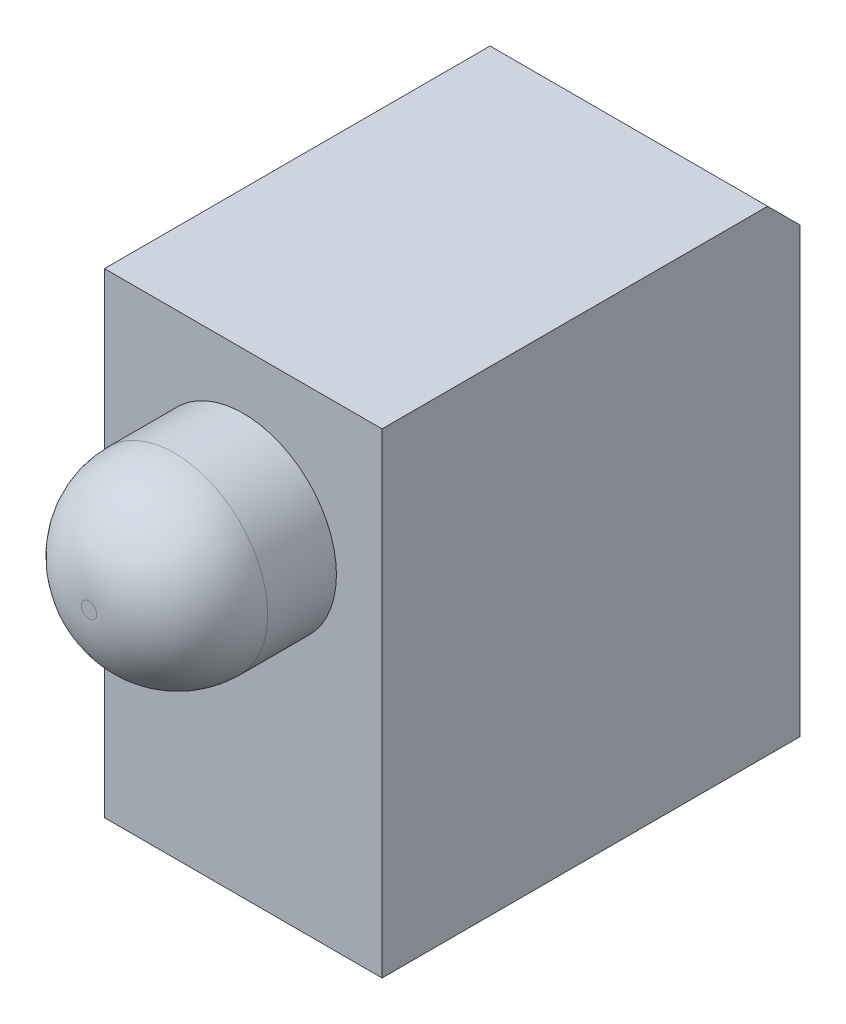
ISO-10303-21;
HEADER;
FILE_DESCRIPTION(('STEP AP214'),'2;1');
FILE_NAME('part.step','',(''),(''),'','','');
FILE_SCHEMA(('AUTOMOTIVE_DESIGN { 1 0 10303 214 1 1 1 1 }'));
ENDSEC;
DATA;
#1=APPLICATION_CONTEXT('core data for automotive mechanical design processes');
#2=APPLICATION_PROTOCOL_DEFINITION('international standard','automotive_design',2000,#1);
#3=PRODUCT_CONTEXT('',#1,'mechanical');
#4=PRODUCT('Part','Part','',(#3));
#5=PRODUCT_RELATED_PRODUCT_CATEGORY('part','',(#4));
#6=PRODUCT_DEFINITION_FORMATION('','',#4);
#7=PRODUCT_DEFINITION_CONTEXT('part definition',#1,'design');
#8=PRODUCT_DEFINITION('design','',#6,#7);
#9=PRODUCT_DEFINITION_SHAPE('','',#8);
#10=(LENGTH_UNIT() NAMED_UNIT(*) SI_UNIT(.MILLI.,.METRE.));
#11=(NAMED_UNIT(*) PLANE_ANGLE_UNIT() SI_UNIT($,.RADIAN.));
#12=(NAMED_UNIT(*) SI_UNIT($,.STERADIAN.) SOLID_ANGLE_UNIT());
#13=UNCERTAINTY_MEASURE_WITH_UNIT(LENGTH_MEASURE(1.E-05),#10,'distance_accuracy_value','');
#14=(GEOMETRIC_REPRESENTATION_CONTEXT(3) GLOBAL_UNCERTAINTY_ASSIGNED_CONTEXT((#13)) GLOBAL_UNIT_ASSIGNED_CONTEXT((#10,
#11,#12)) REPRESENTATION_CONTEXT('',''));
#15=CARTESIAN_POINT('',(0.,0.,0.));
#16=DIRECTION('',(0.,0.,1.));
#17=DIRECTION('',(1.,0.,0.));
#18=AXIS2_PLACEMENT_3D('',#15,#16,#17);
#19=CARTESIAN_POINT('',(-2.16,-3.7,3.25));
#20=DIRECTION('',(0.,0.,1.));
#21=DIRECTION('',(1.,0.,0.));
#22=AXIS2_PLACEMENT_3D('',#19,#20,#21);
#23=PLANE('',#22);
#24=DIRECTION('',(1.,0.,0.));
#25=VECTOR('',#24,1.);
#26=CARTESIAN_POINT('',(-2.16,-3.7,3.25));
#27=LINE('',#26,#25);
#28=CARTESIAN_POINT('',(-2.16,-3.7,3.25));
#29=VERTEX_POINT('',#28);
#30=CARTESIAN_POINT('',(2.16,-3.7,3.25));
#31=VERTEX_POINT('',#30);
#32=EDGE_CURVE('E91',#29,#31,#27,.T.);
#33=ORIENTED_EDGE('',*,*,#32,.T.);
#34=DIRECTION('',(0.,-1.,0.));
#35=VECTOR('',#34,1.);
#36=CARTESIAN_POINT('',(2.16,-3.7,3.25));
#37=LINE('',#36,#35);
#38=CARTESIAN_POINT('',(2.16,3.7,3.25));
#39=VERTEX_POINT('',#38);
#40=EDGE_CURVE('E80',#39,#31,#37,.T.);
#41=ORIENTED_EDGE('',*,*,#40,.F.);
#42=DIRECTION('',(1.,0.,0.));
#43=VECTOR('',#42,1.);
#44=CARTESIAN_POINT('',(-2.16,3.7,3.25));
#45=LINE('',#44,#43);
#46=CARTESIAN_POINT('',(-2.16,3.7,3.25));
#47=VERTEX_POINT('',#46);
#48=EDGE_CURVE('E85',#47,#39,#45,.T.);
#49=ORIENTED_EDGE('',*,*,#48,.F.);
#50=DIRECTION('',(0.,-1.,0.));
#51=VECTOR('',#50,1.);
#52=CARTESIAN_POINT('',(-2.16,-3.7,3.25));
#53=LINE('',#52,#51);
#54=EDGE_CURVE('E104',#47,#29,#53,.T.);
#55=ORIENTED_EDGE('',*,*,#54,.T.);
#56=EDGE_LOOP('',(#33,#41,#49,#55));
#57=FACE_BOUND('',#56,.T.);
#58=CARTESIAN_POINT('',(0.,1.38,3.25));
#59=DIRECTION('',(0.,0.,1.));
#60=DIRECTION('',(1.,0.,0.));
#61=AXIS2_PLACEMENT_3D('',#58,#59,#60);
#62=CIRCLE('',#61,1.45);
#63=CARTESIAN_POINT('',(1.45,1.38,3.25));
#64=VERTEX_POINT('',#63);
#65=EDGE_CURVE('E127',#64,#64,#62,.T.);
#66=ORIENTED_EDGE('',*,*,#65,.F.);
#67=EDGE_LOOP('',(#66));
#68=FACE_BOUND('',#67,.T.);
#69=ADVANCED_FACE('F32',(#57,#68),#23,.T.);
#70=CARTESIAN_POINT('',(-2.16,-3.7,-3.25));
#71=DIRECTION('',(0.,0.,-1.));
#72=DIRECTION('',(-1.,0.,0.));
#73=AXIS2_PLACEMENT_3D('',#70,#71,#72);
#74=PLANE('',#73);
#75=DIRECTION('',(0.,1.,0.));
#76=VECTOR('',#75,1.);
#77=CARTESIAN_POINT('',(-2.16,-3.7,-3.25));
#78=LINE('',#77,#76);
#79=CARTESIAN_POINT('',(-2.16,-3.7,-3.25));
#80=VERTEX_POINT('',#79);
#81=CARTESIAN_POINT('',(-2.16,3.2,-3.25));
#82=VERTEX_POINT('',#81);
#83=EDGE_CURVE('E97',#80,#82,#78,.T.);
#84=ORIENTED_EDGE('',*,*,#83,.T.);
#85=DIRECTION('',(1.,0.,0.));
#86=VECTOR('',#85,1.);
#87=CARTESIAN_POINT('',(-2.16,3.2,-3.25));
#88=LINE('',#87,#86);
#89=CARTESIAN_POINT('',(2.16,3.2,-3.25));
#90=VERTEX_POINT('',#89);
#91=EDGE_CURVE('E117',#82,#90,#88,.T.);
#92=ORIENTED_EDGE('',*,*,#91,.T.);
#93=DIRECTION('',(0.,1.,0.));
#94=VECTOR('',#93,1.);
#95=CARTESIAN_POINT('',(2.16,-3.7,-3.25));
#96=LINE('',#95,#94);
#97=CARTESIAN_POINT('',(2.16,-3.7,-3.25));
#98=VERTEX_POINT('',#97);
#99=EDGE_CURVE('E82',#98,#90,#96,.T.);
#100=ORIENTED_EDGE('',*,*,#99,.F.);
#101=DIRECTION('',(1.,0.,0.));
#102=VECTOR('',#101,1.);
#103=CARTESIAN_POINT('',(-2.16,-3.7,-3.25));
#104=LINE('',#103,#102);
#105=EDGE_CURVE('E108',#80,#98,#104,.T.);
#106=ORIENTED_EDGE('',*,*,#105,.F.);
#107=EDGE_LOOP('',(#84,#92,#100,#106));
#108=FACE_BOUND('',#107,.T.);
#109=ADVANCED_FACE('F123',(#108),#74,.T.);
#110=CARTESIAN_POINT('',(-2.16,-3.7,3.25));
#111=DIRECTION('',(0.,-1.,0.));
#112=DIRECTION('',(0.,0.,-1.));
#113=AXIS2_PLACEMENT_3D('',#110,#111,#112);
#114=PLANE('',#113);
#115=ORIENTED_EDGE('',*,*,#105,.T.);
#116=DIRECTION('',(0.,0.,-1.));
#117=VECTOR('',#116,1.);
#118=CARTESIAN_POINT('',(2.16,-3.7,3.25));
#119=LINE('',#118,#117);
#120=EDGE_CURVE('E95',#31,#98,#119,.T.);
#121=ORIENTED_EDGE('',*,*,#120,.F.);
#122=ORIENTED_EDGE('',*,*,#32,.F.);
#123=DIRECTION('',(0.,0.,-1.));
#124=VECTOR('',#123,1.);
#125=CARTESIAN_POINT('',(-2.16,-3.7,3.25));
#126=LINE('',#125,#124);
#127=EDGE_CURVE('E92',#29,#80,#126,.T.);
#128=ORIENTED_EDGE('',*,*,#127,.T.);
#129=EDGE_LOOP('',(#115,#121,#122,#128));
#130=FACE_BOUND('',#129,.T.);
#131=ADVANCED_FACE('F138',(#130),#114,.T.);
#132=CARTESIAN_POINT('',(-2.16,3.7,3.25));
#133=DIRECTION('',(0.,1.,0.));
#134=DIRECTION('',(0.,0.,1.));
#135=AXIS2_PLACEMENT_3D('',#132,#133,#134);
#136=PLANE('',#135);
#137=DIRECTION('',(0.,0.,1.));
#138=VECTOR('',#137,1.);
#139=CARTESIAN_POINT('',(2.16,3.7,3.25));
#140=LINE('',#139,#138);
#141=CARTESIAN_POINT('',(2.16,3.7,-2.74999999999999));
#142=VERTEX_POINT('',#141);
#143=EDGE_CURVE('E75',#142,#39,#140,.T.);
#144=ORIENTED_EDGE('',*,*,#143,.F.);
#145=DIRECTION('',(-1.,0.,0.));
#146=VECTOR('',#145,1.);
#147=CARTESIAN_POINT('',(-2.16,3.7,-2.75));
#148=LINE('',#147,#146);
#149=CARTESIAN_POINT('',(-2.16,3.7,-2.74999999999999));
#150=VERTEX_POINT('',#149);
#151=EDGE_CURVE('E40',#142,#150,#148,.T.);
#152=ORIENTED_EDGE('',*,*,#151,.T.);
#153=DIRECTION('',(0.,0.,1.));
#154=VECTOR('',#153,1.);
#155=CARTESIAN_POINT('',(-2.16,3.7,3.25));
#156=LINE('',#155,#154);
#157=EDGE_CURVE('E87',#150,#47,#156,.T.);
#158=ORIENTED_EDGE('',*,*,#157,.T.);
#159=ORIENTED_EDGE('',*,*,#48,.T.);
#160=EDGE_LOOP('',(#144,#152,#158,#159));
#161=FACE_BOUND('',#160,.T.);
#162=ADVANCED_FACE('F86',(#161),#136,.T.);
#163=CARTESIAN_POINT('',(-2.16,0.,0.));
#164=DIRECTION('',(-1.,0.,0.));
#165=DIRECTION('',(0.,0.,1.));
#166=AXIS2_PLACEMENT_3D('',#163,#164,#165);
#167=PLANE('',#166);
#168=ORIENTED_EDGE('',*,*,#157,.F.);
#169=DIRECTION('',(0.,0.707106781186545,0.70710678118655));
#170=VECTOR('',#169,1.);
#171=CARTESIAN_POINT('',(-2.16,3.22500000000001,-3.22499999999999));
#172=LINE('',#171,#170);
#173=EDGE_CURVE('E11',#150,#82,#172,.F.);
#174=ORIENTED_EDGE('',*,*,#173,.T.);
#175=ORIENTED_EDGE('',*,*,#83,.F.);
#176=ORIENTED_EDGE('',*,*,#127,.F.);
#177=ORIENTED_EDGE('',*,*,#54,.F.);
#178=EDGE_LOOP('',(#168,#174,#175,#176,#177));
#179=FACE_BOUND('',#178,.T.);
#180=ADVANCED_FACE('F144',(#179),#167,.T.);
#181=CARTESIAN_POINT('',(2.16,0.,0.));
#182=DIRECTION('',(-1.,0.,0.));
#183=DIRECTION('',(0.,0.,1.));
#184=AXIS2_PLACEMENT_3D('',#181,#182,#183);
#185=PLANE('',#184);
#186=ORIENTED_EDGE('',*,*,#99,.T.);
#187=DIRECTION('',(0.,-0.707106781186545,-0.70710678118655));
#188=VECTOR('',#187,1.);
#189=CARTESIAN_POINT('',(2.16,3.2,-3.25));
#190=LINE('',#189,#188);
#191=EDGE_CURVE('E54',#90,#142,#190,.F.);
#192=ORIENTED_EDGE('',*,*,#191,.T.);
#193=ORIENTED_EDGE('',*,*,#143,.T.);
#194=ORIENTED_EDGE('',*,*,#40,.T.);
#195=ORIENTED_EDGE('',*,*,#120,.T.);
#196=EDGE_LOOP('',(#186,#192,#193,#194,#195));
#197=FACE_BOUND('',#196,.T.);
#198=ADVANCED_FACE('F77',(#197),#185,.F.);
#199=CARTESIAN_POINT('',(0.,1.38,5.65));
#200=DIRECTION('',(0.,0.,-1.));
#201=DIRECTION('',(-1.,0.,0.));
#202=AXIS2_PLACEMENT_3D('',#199,#200,#201);
#203=CYLINDRICAL_SURFACE('',#202,1.45);
#204=CARTESIAN_POINT('',(0.,1.38,4.32));
#205=DIRECTION('',(0.,0.,1.));
#206=DIRECTION('',(1.,0.,0.));
#207=AXIS2_PLACEMENT_3D('',#204,#205,#206);
#208=CIRCLE('',#207,1.45);
#209=CARTESIAN_POINT('',(1.45,1.38,4.32));
#210=VERTEX_POINT('',#209);
#211=EDGE_CURVE('E114',#210,#210,#208,.F.);
#212=ORIENTED_EDGE('',*,*,#211,.T.);
#213=EDGE_LOOP('',(#212));
#214=FACE_BOUND('',#213,.T.);
#215=ORIENTED_EDGE('',*,*,#65,.T.);
#216=EDGE_LOOP('',(#215));
#217=FACE_BOUND('',#216,.T.);
#218=ADVANCED_FACE('F132',(#214,#217),#203,.T.);
#219=CARTESIAN_POINT('',(0.,1.38,5.65));
#220=DIRECTION('',(0.,0.,1.));
#221=DIRECTION('',(1.,0.,0.));
#222=AXIS2_PLACEMENT_3D('',#219,#220,#221);
#223=PLANE('',#222);
#224=CARTESIAN_POINT('',(0.,1.38,5.65));
#225=DIRECTION('',(0.,0.,1.));
#226=DIRECTION('',(1.,0.,0.));
#227=AXIS2_PLACEMENT_3D('',#224,#225,#226);
#228=CIRCLE('',#227,0.12);
#229=CARTESIAN_POINT('',(0.12,1.38,5.65));
#230=VERTEX_POINT('',#229);
#231=EDGE_CURVE('E110',#230,#230,#228,.T.);
#232=ORIENTED_EDGE('',*,*,#231,.T.);
#233=EDGE_LOOP('',(#232));
#234=FACE_BOUND('',#233,.T.);
#235=ADVANCED_FACE('F147',(#234),#223,.T.);
#236=CARTESIAN_POINT('',(0.,1.38,4.32));
#237=DIRECTION('',(0.,0.,1.));
#238=DIRECTION('',(1.,0.,0.));
#239=AXIS2_PLACEMENT_3D('',#236,#237,#238);
#240=DEGENERATE_TOROIDAL_SURFACE('',#239,0.12,1.33,.T.);
#241=ORIENTED_EDGE('',*,*,#211,.F.);
#242=EDGE_LOOP('',(#241));
#243=FACE_BOUND('',#242,.T.);
#244=ORIENTED_EDGE('',*,*,#231,.F.);
#245=EDGE_LOOP('',(#244));
#246=FACE_BOUND('',#245,.T.);
#247=ADVANCED_FACE('F145',(#243,#246),#240,.T.);
#248=CARTESIAN_POINT('',(-2.16,3.2,-3.25));
#249=DIRECTION('',(0.,-0.70710678118655,0.707106781186545));
#250=DIRECTION('',(1.,0.,0.));
#251=AXIS2_PLACEMENT_3D('',#248,#249,#250);
#252=PLANE('',#251);
#253=ORIENTED_EDGE('',*,*,#173,.F.);
#254=ORIENTED_EDGE('',*,*,#151,.F.);
#255=ORIENTED_EDGE('',*,*,#191,.F.);
#256=ORIENTED_EDGE('',*,*,#91,.F.);
#257=EDGE_LOOP('',(#253,#254,#255,#256));
#258=FACE_BOUND('',#257,.T.);
#259=ADVANCED_FACE('F34',(#258),#252,.F.);
#260=CLOSED_SHELL('',(#69,#109,#131,#162,#180,#198,#218,#235,#247,#259));
#261=MANIFOLD_SOLID_BREP('B2',#260);
#262=ADVANCED_BREP_SHAPE_REPRESENTATION('',(#18,#261),#14);
#263=SHAPE_DEFINITION_REPRESENTATION(#9,#262);
ENDSEC;
END-ISO-10303-21;
